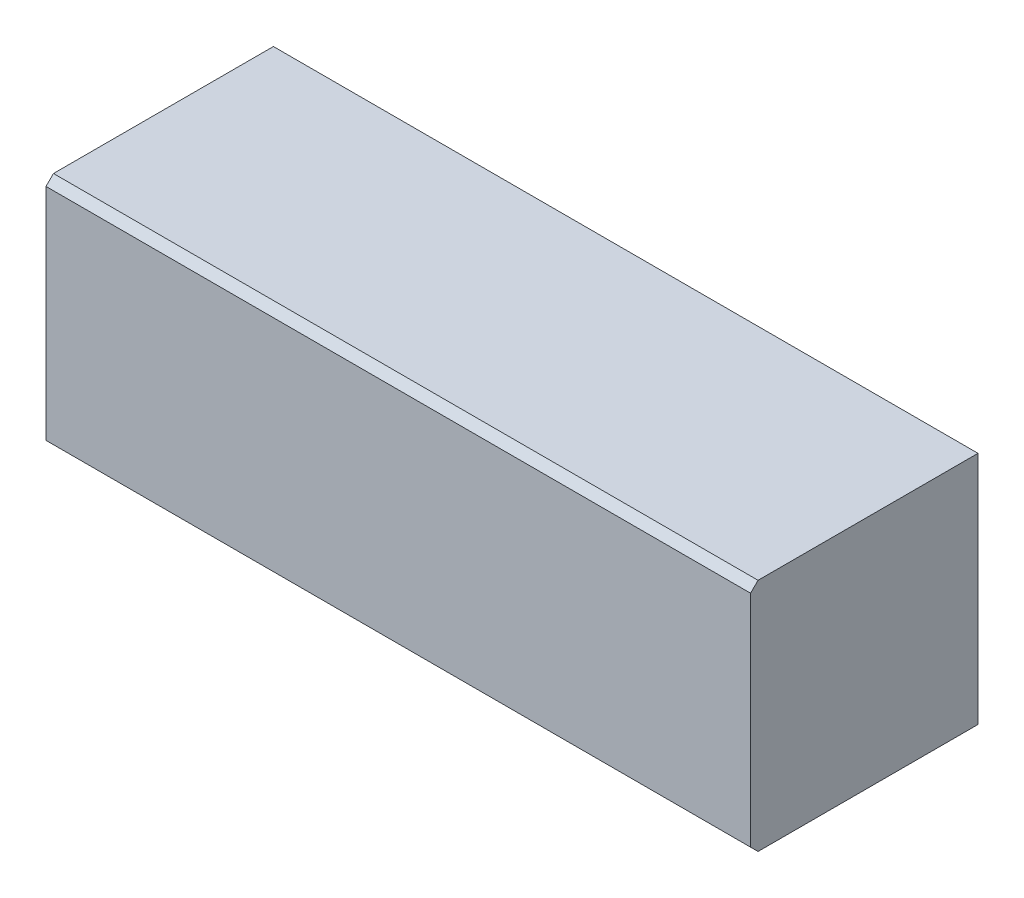
ISO-10303-21;
HEADER;
FILE_DESCRIPTION(('STEP AP214'),'2;1');
FILE_NAME('part.step','',(''),(''),'','','');
FILE_SCHEMA(('AUTOMOTIVE_DESIGN { 1 0 10303 214 1 1 1 1 }'));
ENDSEC;
DATA;
#1=APPLICATION_CONTEXT('core data for automotive mechanical design processes');
#2=APPLICATION_PROTOCOL_DEFINITION('international standard','automotive_design',2000,#1);
#3=PRODUCT_CONTEXT('',#1,'mechanical');
#4=PRODUCT('Part','Part','',(#3));
#5=PRODUCT_RELATED_PRODUCT_CATEGORY('part','',(#4));
#6=PRODUCT_DEFINITION_FORMATION('','',#4);
#7=PRODUCT_DEFINITION_CONTEXT('part definition',#1,'design');
#8=PRODUCT_DEFINITION('design','',#6,#7);
#9=PRODUCT_DEFINITION_SHAPE('','',#8);
#10=(LENGTH_UNIT() NAMED_UNIT(*) SI_UNIT(.MILLI.,.METRE.));
#11=(NAMED_UNIT(*) PLANE_ANGLE_UNIT() SI_UNIT($,.RADIAN.));
#12=(NAMED_UNIT(*) SI_UNIT($,.STERADIAN.) SOLID_ANGLE_UNIT());
#13=UNCERTAINTY_MEASURE_WITH_UNIT(LENGTH_MEASURE(1.E-05),#10,'distance_accuracy_value','');
#14=(GEOMETRIC_REPRESENTATION_CONTEXT(3) GLOBAL_UNCERTAINTY_ASSIGNED_CONTEXT((#13)) GLOBAL_UNIT_ASSIGNED_CONTEXT((#10,
#11,#12)) REPRESENTATION_CONTEXT('',''));
#15=CARTESIAN_POINT('',(0.,0.,0.));
#16=DIRECTION('',(0.,0.,1.));
#17=DIRECTION('',(1.,0.,0.));
#18=AXIS2_PLACEMENT_3D('',#15,#16,#17);
#19=CARTESIAN_POINT('',(12.,-18.9437501147141,-2.00000000000001));
#20=DIRECTION('',(0.,-0.707106781186543,-0.707106781186552));
#21=DIRECTION('',(0.,0.707106781186552,-0.707106781186543));
#22=AXIS2_PLACEMENT_3D('',#19,#20,#21);
#23=PLANE('',#22);
#24=DIRECTION('',(1.,0.,0.));
#25=VECTOR('',#24,1.);
#26=CARTESIAN_POINT('',(12.,-18.8167501147141,-2.12700000000001));
#27=LINE('',#26,#25);
#28=CARTESIAN_POINT('',(12.,-18.8167501147141,-2.12700000000001));
#29=VERTEX_POINT('',#28);
#30=CARTESIAN_POINT('',(0.,-18.8167501147141,-2.12700000000001));
#31=VERTEX_POINT('',#30);
#32=EDGE_CURVE('E102',#29,#31,#27,.F.);
#33=ORIENTED_EDGE('',*,*,#32,.T.);
#34=DIRECTION('',(0.,0.707106781186552,-0.707106781186543));
#35=VECTOR('',#34,1.);
#36=CARTESIAN_POINT('',(0.,-18.9437501147141,-2.00000000000001));
#37=LINE('',#36,#35);
#38=CARTESIAN_POINT('',(0.,-18.9437501147141,-2.00000000000001));
#39=VERTEX_POINT('',#38);
#40=EDGE_CURVE('E20',#39,#31,#37,.T.);
#41=ORIENTED_EDGE('',*,*,#40,.F.);
#42=DIRECTION('',(-1.,0.,0.));
#43=VECTOR('',#42,1.);
#44=CARTESIAN_POINT('',(12.,-18.9437501147141,-2.00000000000001));
#45=LINE('',#44,#43);
#46=CARTESIAN_POINT('',(12.,-18.9437501147141,-2.00000000000001));
#47=VERTEX_POINT('',#46);
#48=EDGE_CURVE('E110',#39,#47,#45,.F.);
#49=ORIENTED_EDGE('',*,*,#48,.T.);
#50=DIRECTION('',(0.,0.707106781186552,-0.707106781186543));
#51=VECTOR('',#50,1.);
#52=CARTESIAN_POINT('',(12.,-18.9437501147141,-2.00000000000001));
#53=LINE('',#52,#51);
#54=EDGE_CURVE('E113',#29,#47,#53,.F.);
#55=ORIENTED_EDGE('',*,*,#54,.F.);
#56=EDGE_LOOP('',(#33,#41,#49,#55));
#57=FACE_BOUND('',#56,.T.);
#58=ADVANCED_FACE('F17',(#57),#23,.F.);
#59=CARTESIAN_POINT('',(12.,-18.8167501147141,-5.87300000000001));
#60=DIRECTION('',(0.,-0.707106781186543,0.707106781186552));
#61=DIRECTION('',(0.,-0.707106781186552,-0.707106781186543));
#62=AXIS2_PLACEMENT_3D('',#59,#60,#61);
#63=PLANE('',#62);
#64=DIRECTION('',(1.,0.,0.));
#65=VECTOR('',#64,1.);
#66=CARTESIAN_POINT('',(12.,-18.8167501147141,-5.87300000000001));
#67=LINE('',#66,#65);
#68=CARTESIAN_POINT('',(0.,-18.8167501147141,-5.87300000000001));
#69=VERTEX_POINT('',#68);
#70=CARTESIAN_POINT('',(12.,-18.8167501147141,-5.87300000000001));
#71=VERTEX_POINT('',#70);
#72=EDGE_CURVE('E85',#69,#71,#67,.T.);
#73=ORIENTED_EDGE('',*,*,#72,.T.);
#74=DIRECTION('',(0.577350269189628,0.577350269189628,0.577350269189621));
#75=VECTOR('',#74,1.);
#76=CARTESIAN_POINT('',(11.873,-18.9437501147141,-6.00000000000001));
#77=LINE('',#76,#75);
#78=CARTESIAN_POINT('',(11.873,-18.9437501147141,-6.00000000000001));
#79=VERTEX_POINT('',#78);
#80=EDGE_CURVE('E79',#79,#71,#77,.T.);
#81=ORIENTED_EDGE('',*,*,#80,.F.);
#82=DIRECTION('',(1.,0.,0.));
#83=VECTOR('',#82,1.);
#84=CARTESIAN_POINT('',(12.,-18.9437501147141,-6.00000000000001));
#85=LINE('',#84,#83);
#86=CARTESIAN_POINT('',(0.,-18.9437501147141,-6.00000000000001));
#87=VERTEX_POINT('',#86);
#88=EDGE_CURVE('E82',#79,#87,#85,.F.);
#89=ORIENTED_EDGE('',*,*,#88,.T.);
#90=DIRECTION('',(0.,-0.707106781186552,-0.707106781186543));
#91=VECTOR('',#90,1.);
#92=CARTESIAN_POINT('',(0.,-18.8167501147141,-5.87300000000001));
#93=LINE('',#92,#91);
#94=EDGE_CURVE('E74',#69,#87,#93,.T.);
#95=ORIENTED_EDGE('',*,*,#94,.F.);
#96=EDGE_LOOP('',(#73,#81,#89,#95));
#97=FACE_BOUND('',#96,.T.);
#98=ADVANCED_FACE('F81',(#97),#63,.F.);
#99=CARTESIAN_POINT('',(12.,-18.8167501147141,-2.00000000000001));
#100=DIRECTION('',(0.,0.,-1.));
#101=DIRECTION('',(-1.,0.,0.));
#102=AXIS2_PLACEMENT_3D('',#99,#100,#101);
#103=PLANE('',#102);
#104=DIRECTION('',(1.,0.,0.));
#105=VECTOR('',#104,1.);
#106=CARTESIAN_POINT('',(12.,-22.6897501147141,-2.00000000000001));
#107=LINE('',#106,#105);
#108=CARTESIAN_POINT('',(0.,-22.6897501147141,-2.00000000000001));
#109=VERTEX_POINT('',#108);
#110=CARTESIAN_POINT('',(12.,-22.6897501147141,-2.00000000000001));
#111=VERTEX_POINT('',#110);
#112=EDGE_CURVE('E131',#109,#111,#107,.T.);
#113=ORIENTED_EDGE('',*,*,#112,.T.);
#114=DIRECTION('',(0.,1.,0.));
#115=VECTOR('',#114,1.);
#116=CARTESIAN_POINT('',(12.,-22.8167501147141,-2.00000000000001));
#117=LINE('',#116,#115);
#118=EDGE_CURVE('E134',#47,#111,#117,.F.);
#119=ORIENTED_EDGE('',*,*,#118,.F.);
#120=ORIENTED_EDGE('',*,*,#48,.F.);
#121=DIRECTION('',(0.,1.,0.));
#122=VECTOR('',#121,1.);
#123=CARTESIAN_POINT('',(0.,-22.8167501147141,-2.00000000000001));
#124=LINE('',#123,#122);
#125=EDGE_CURVE('E120',#39,#109,#124,.F.);
#126=ORIENTED_EDGE('',*,*,#125,.T.);
#127=EDGE_LOOP('',(#113,#119,#120,#126));
#128=FACE_BOUND('',#127,.T.);
#129=ADVANCED_FACE('F173',(#128),#103,.F.);
#130=CARTESIAN_POINT('',(12.,-22.8167501147141,-5.87300000000001));
#131=DIRECTION('',(0.707106781186543,0.,-0.707106781186552));
#132=DIRECTION('',(-0.707106781186552,0.,-0.707106781186543));
#133=AXIS2_PLACEMENT_3D('',#130,#131,#132);
#134=PLANE('',#133);
#135=ORIENTED_EDGE('',*,*,#80,.T.);
#136=DIRECTION('',(0.,1.,0.));
#137=VECTOR('',#136,1.);
#138=CARTESIAN_POINT('',(12.,-22.8167501147141,-5.87300000000001));
#139=LINE('',#138,#137);
#140=CARTESIAN_POINT('',(12.,-22.8167501147141,-5.87300000000001));
#141=VERTEX_POINT('',#140);
#142=EDGE_CURVE('E137',#141,#71,#139,.T.);
#143=ORIENTED_EDGE('',*,*,#142,.F.);
#144=DIRECTION('',(-0.707106781186552,0.,-0.707106781186543));
#145=VECTOR('',#144,1.);
#146=CARTESIAN_POINT('',(12.,-22.8167501147141,-5.87300000000001));
#147=LINE('',#146,#145);
#148=CARTESIAN_POINT('',(11.873,-22.8167501147141,-6.00000000000001));
#149=VERTEX_POINT('',#148);
#150=EDGE_CURVE('E91',#141,#149,#147,.T.);
#151=ORIENTED_EDGE('',*,*,#150,.T.);
#152=DIRECTION('',(0.,1.,0.));
#153=VECTOR('',#152,1.);
#154=CARTESIAN_POINT('',(11.873,-18.8167501147141,-6.00000000000001));
#155=LINE('',#154,#153);
#156=EDGE_CURVE('E97',#149,#79,#155,.T.);
#157=ORIENTED_EDGE('',*,*,#156,.T.);
#158=EDGE_LOOP('',(#135,#143,#151,#157));
#159=FACE_BOUND('',#158,.T.);
#160=ADVANCED_FACE('F101',(#159),#134,.T.);
#161=CARTESIAN_POINT('',(12.,-18.8167501147141,-2.00000000000001));
#162=DIRECTION('',(0.,-1.,0.));
#163=DIRECTION('',(0.,0.,-1.));
#164=AXIS2_PLACEMENT_3D('',#161,#162,#163);
#165=PLANE('',#164);
#166=ORIENTED_EDGE('',*,*,#32,.F.);
#167=DIRECTION('',(0.,0.,-1.));
#168=VECTOR('',#167,1.);
#169=CARTESIAN_POINT('',(12.,-18.8167501147141,-2.00000000000001));
#170=LINE('',#169,#168);
#171=EDGE_CURVE('E139',#71,#29,#170,.F.);
#172=ORIENTED_EDGE('',*,*,#171,.F.);
#173=ORIENTED_EDGE('',*,*,#72,.F.);
#174=DIRECTION('',(0.,0.,-1.));
#175=VECTOR('',#174,1.);
#176=CARTESIAN_POINT('',(0.,-18.8167501147141,-2.00000000000001));
#177=LINE('',#176,#175);
#178=EDGE_CURVE('E119',#69,#31,#177,.F.);
#179=ORIENTED_EDGE('',*,*,#178,.T.);
#180=EDGE_LOOP('',(#166,#172,#173,#179));
#181=FACE_BOUND('',#180,.T.);
#182=ADVANCED_FACE('F125',(#181),#165,.F.);
#183=CARTESIAN_POINT('',(12.,-18.8167501147141,-6.00000000000001));
#184=DIRECTION('',(0.,0.,1.));
#185=DIRECTION('',(1.,0.,0.));
#186=AXIS2_PLACEMENT_3D('',#183,#184,#185);
#187=PLANE('',#186);
#188=ORIENTED_EDGE('',*,*,#156,.F.);
#189=DIRECTION('',(1.,0.,0.));
#190=VECTOR('',#189,1.);
#191=CARTESIAN_POINT('',(12.,-22.8167501147141,-6.00000000000001));
#192=LINE('',#191,#190);
#193=CARTESIAN_POINT('',(0.,-22.8167501147141,-6.00000000000001));
#194=VERTEX_POINT('',#193);
#195=EDGE_CURVE('E141',#149,#194,#192,.F.);
#196=ORIENTED_EDGE('',*,*,#195,.T.);
#197=DIRECTION('',(0.,1.,0.));
#198=VECTOR('',#197,1.);
#199=CARTESIAN_POINT('',(0.,-22.8167501147141,-6.00000000000001));
#200=LINE('',#199,#198);
#201=EDGE_CURVE('E99',#194,#87,#200,.T.);
#202=ORIENTED_EDGE('',*,*,#201,.T.);
#203=ORIENTED_EDGE('',*,*,#88,.F.);
#204=EDGE_LOOP('',(#188,#196,#202,#203));
#205=FACE_BOUND('',#204,.T.);
#206=ADVANCED_FACE('F95',(#205),#187,.F.);
#207=CARTESIAN_POINT('',(0.,-22.8167501147141,-2.00000000000001));
#208=DIRECTION('',(1.,0.,0.));
#209=DIRECTION('',(0.,0.,-1.));
#210=AXIS2_PLACEMENT_3D('',#207,#208,#209);
#211=PLANE('',#210);
#212=DIRECTION('',(0.,0.707106781186543,0.707106781186552));
#213=VECTOR('',#212,1.);
#214=CARTESIAN_POINT('',(0.,-22.8167501147141,-2.12700000000001));
#215=LINE('',#214,#213);
#216=CARTESIAN_POINT('',(0.,-22.8167501147141,-2.12700000000001));
#217=VERTEX_POINT('',#216);
#218=EDGE_CURVE('E127',#217,#109,#215,.T.);
#219=ORIENTED_EDGE('',*,*,#218,.T.);
#220=ORIENTED_EDGE('',*,*,#125,.F.);
#221=ORIENTED_EDGE('',*,*,#40,.T.);
#222=ORIENTED_EDGE('',*,*,#178,.F.);
#223=ORIENTED_EDGE('',*,*,#94,.T.);
#224=ORIENTED_EDGE('',*,*,#201,.F.);
#225=DIRECTION('',(0.,0.,1.));
#226=VECTOR('',#225,1.);
#227=CARTESIAN_POINT('',(0.,-22.8167501147141,-2.00000000000001));
#228=LINE('',#227,#226);
#229=EDGE_CURVE('E143',#194,#217,#228,.T.);
#230=ORIENTED_EDGE('',*,*,#229,.T.);
#231=EDGE_LOOP('',(#219,#220,#221,#222,#223,#224,#230));
#232=FACE_BOUND('',#231,.T.);
#233=ADVANCED_FACE('F117',(#232),#211,.F.);
#234=CARTESIAN_POINT('',(12.,-22.8167501147141,-2.12700000000001));
#235=DIRECTION('',(0.,0.707106781186552,-0.707106781186543));
#236=DIRECTION('',(0.,0.707106781186543,0.707106781186552));
#237=AXIS2_PLACEMENT_3D('',#234,#235,#236);
#238=PLANE('',#237);
#239=ORIENTED_EDGE('',*,*,#112,.F.);
#240=ORIENTED_EDGE('',*,*,#218,.F.);
#241=DIRECTION('',(1.,0.,0.));
#242=VECTOR('',#241,1.);
#243=CARTESIAN_POINT('',(12.,-22.8167501147141,-2.12700000000001));
#244=LINE('',#243,#242);
#245=CARTESIAN_POINT('',(12.,-22.8167501147141,-2.12700000000001));
#246=VERTEX_POINT('',#245);
#247=EDGE_CURVE('E26',#217,#246,#244,.T.);
#248=ORIENTED_EDGE('',*,*,#247,.T.);
#249=DIRECTION('',(0.,-0.707106781186545,-0.70710678118655));
#250=VECTOR('',#249,1.);
#251=CARTESIAN_POINT('',(12.,-22.6897501147141,-2.00000000000001));
#252=LINE('',#251,#250);
#253=EDGE_CURVE('E34',#111,#246,#252,.T.);
#254=ORIENTED_EDGE('',*,*,#253,.F.);
#255=EDGE_LOOP('',(#239,#240,#248,#254));
#256=FACE_BOUND('',#255,.T.);
#257=ADVANCED_FACE('F150',(#256),#238,.F.);
#258=CARTESIAN_POINT('',(12.,-22.8167501147141,-2.00000000000001));
#259=DIRECTION('',(1.,0.,0.));
#260=DIRECTION('',(0.,0.,-1.));
#261=AXIS2_PLACEMENT_3D('',#258,#259,#260);
#262=PLANE('',#261);
#263=ORIENTED_EDGE('',*,*,#171,.T.);
#264=ORIENTED_EDGE('',*,*,#54,.T.);
#265=ORIENTED_EDGE('',*,*,#118,.T.);
#266=ORIENTED_EDGE('',*,*,#253,.T.);
#267=DIRECTION('',(0.,0.,1.));
#268=VECTOR('',#267,1.);
#269=CARTESIAN_POINT('',(12.,-22.8167501147141,-2.00000000000001));
#270=LINE('',#269,#268);
#271=EDGE_CURVE('E11',#246,#141,#270,.F.);
#272=ORIENTED_EDGE('',*,*,#271,.T.);
#273=ORIENTED_EDGE('',*,*,#142,.T.);
#274=EDGE_LOOP('',(#263,#264,#265,#266,#272,#273));
#275=FACE_BOUND('',#274,.T.);
#276=ADVANCED_FACE('F154',(#275),#262,.T.);
#277=CARTESIAN_POINT('',(12.,-22.8167501147141,-2.00000000000001));
#278=DIRECTION('',(0.,1.,0.));
#279=DIRECTION('',(0.,0.,1.));
#280=AXIS2_PLACEMENT_3D('',#277,#278,#279);
#281=PLANE('',#280);
#282=ORIENTED_EDGE('',*,*,#247,.F.);
#283=ORIENTED_EDGE('',*,*,#229,.F.);
#284=ORIENTED_EDGE('',*,*,#195,.F.);
#285=ORIENTED_EDGE('',*,*,#150,.F.);
#286=ORIENTED_EDGE('',*,*,#271,.F.);
#287=EDGE_LOOP('',(#282,#283,#284,#285,#286));
#288=FACE_BOUND('',#287,.T.);
#289=ADVANCED_FACE('F153',(#288),#281,.F.);
#290=CLOSED_SHELL('',(#58,#98,#129,#160,#182,#206,#233,#257,#276,#289));
#291=MANIFOLD_SOLID_BREP('B1',#290);
#292=ADVANCED_BREP_SHAPE_REPRESENTATION('',(#18,#291),#14);
#293=SHAPE_DEFINITION_REPRESENTATION(#9,#292);
ENDSEC;
END-ISO-10303-21;
